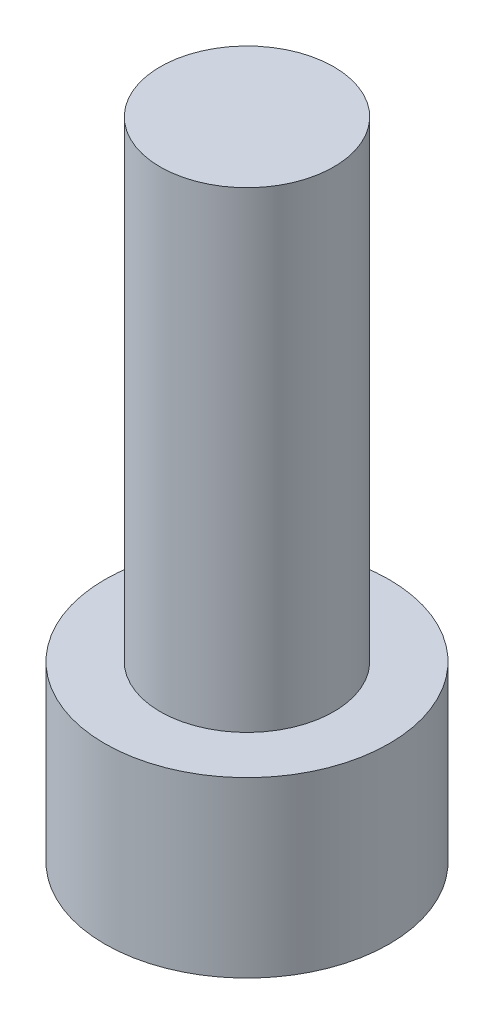
ISO-10303-21;
HEADER;
FILE_DESCRIPTION(('STEP AP214'),'2;1');
FILE_NAME('part.step','',(''),(''),'','','');
FILE_SCHEMA(('AUTOMOTIVE_DESIGN { 1 0 10303 214 1 1 1 1 }'));
ENDSEC;
DATA;
#1=APPLICATION_CONTEXT('core data for automotive mechanical design processes');
#2=APPLICATION_PROTOCOL_DEFINITION('international standard','automotive_design',2000,#1);
#3=PRODUCT_CONTEXT('',#1,'mechanical');
#4=PRODUCT('Part','Part','',(#3));
#5=PRODUCT_RELATED_PRODUCT_CATEGORY('part','',(#4));
#6=PRODUCT_DEFINITION_FORMATION('','',#4);
#7=PRODUCT_DEFINITION_CONTEXT('part definition',#1,'design');
#8=PRODUCT_DEFINITION('design','',#6,#7);
#9=PRODUCT_DEFINITION_SHAPE('','',#8);
#10=(LENGTH_UNIT() NAMED_UNIT(*) SI_UNIT(.MILLI.,.METRE.));
#11=(NAMED_UNIT(*) PLANE_ANGLE_UNIT() SI_UNIT($,.RADIAN.));
#12=(NAMED_UNIT(*) SI_UNIT($,.STERADIAN.) SOLID_ANGLE_UNIT());
#13=UNCERTAINTY_MEASURE_WITH_UNIT(LENGTH_MEASURE(1.E-05),#10,'distance_accuracy_value','');
#14=(GEOMETRIC_REPRESENTATION_CONTEXT(3) GLOBAL_UNCERTAINTY_ASSIGNED_CONTEXT((#13)) GLOBAL_UNIT_ASSIGNED_CONTEXT((#10,
#11,#12)) REPRESENTATION_CONTEXT('',''));
#15=CARTESIAN_POINT('',(0.,0.,0.));
#16=DIRECTION('',(0.,0.,1.));
#17=DIRECTION('',(1.,0.,0.));
#18=AXIS2_PLACEMENT_3D('',#15,#16,#17);
#19=CARTESIAN_POINT('',(0.,3.5052,0.));
#20=DIRECTION('',(0.,1.,0.));
#21=DIRECTION('',(0.,0.,1.));
#22=AXIS2_PLACEMENT_3D('',#19,#20,#21);
#23=PLANE('',#22);
#24=CARTESIAN_POINT('',(0.,3.5052,0.));
#25=DIRECTION('',(0.,1.,0.));
#26=DIRECTION('',(0.,0.,1.));
#27=AXIS2_PLACEMENT_3D('',#24,#25,#26);
#28=CIRCLE('',#27,2.8702);
#29=CARTESIAN_POINT('',(0.,3.5052,2.8702));
#30=VERTEX_POINT('',#29);
#31=EDGE_CURVE('E10',#30,#30,#28,.T.);
#32=ORIENTED_EDGE('',*,*,#31,.T.);
#33=EDGE_LOOP('',(#32));
#34=FACE_BOUND('',#33,.T.);
#35=CARTESIAN_POINT('',(0.,3.5052,0.));
#36=DIRECTION('',(0.,1.,0.));
#37=DIRECTION('',(0.,0.,1.));
#38=AXIS2_PLACEMENT_3D('',#35,#36,#37);
#39=CIRCLE('',#38,1.7526);
#40=CARTESIAN_POINT('',(0.,3.5052,-1.7526));
#41=VERTEX_POINT('',#40);
#42=EDGE_CURVE('E48',#41,#41,#39,.T.);
#43=ORIENTED_EDGE('',*,*,#42,.F.);
#44=EDGE_LOOP('',(#43));
#45=FACE_BOUND('',#44,.T.);
#46=ADVANCED_FACE('F35',(#34,#45),#23,.T.);
#47=CARTESIAN_POINT('',(0.,3.5052,0.));
#48=DIRECTION('',(0.,-1.,0.));
#49=DIRECTION('',(0.,0.,-1.));
#50=AXIS2_PLACEMENT_3D('',#47,#48,#49);
#51=CYLINDRICAL_SURFACE('',#50,2.8702);
#52=ORIENTED_EDGE('',*,*,#31,.F.);
#53=EDGE_LOOP('',(#52));
#54=FACE_BOUND('',#53,.T.);
#55=CARTESIAN_POINT('',(0.,0.,0.));
#56=DIRECTION('',(0.,1.,0.));
#57=DIRECTION('',(0.,0.,1.));
#58=AXIS2_PLACEMENT_3D('',#55,#56,#57);
#59=CIRCLE('',#58,2.8702);
#60=CARTESIAN_POINT('',(0.,0.,2.8702));
#61=VERTEX_POINT('',#60);
#62=EDGE_CURVE('E39',#61,#61,#59,.T.);
#63=ORIENTED_EDGE('',*,*,#62,.T.);
#64=EDGE_LOOP('',(#63));
#65=FACE_BOUND('',#64,.T.);
#66=ADVANCED_FACE('F37',(#54,#65),#51,.T.);
#67=CARTESIAN_POINT('',(0.,0.,0.));
#68=DIRECTION('',(0.,1.,0.));
#69=DIRECTION('',(0.,0.,1.));
#70=AXIS2_PLACEMENT_3D('',#67,#68,#69);
#71=PLANE('',#70);
#72=ORIENTED_EDGE('',*,*,#62,.F.);
#73=EDGE_LOOP('',(#72));
#74=FACE_BOUND('',#73,.T.);
#75=ADVANCED_FACE('F59',(#74),#71,.F.);
#76=CARTESIAN_POINT('',(0.,13.0302,0.));
#77=DIRECTION('',(0.,-1.,0.));
#78=DIRECTION('',(0.,0.,-1.));
#79=AXIS2_PLACEMENT_3D('',#76,#77,#78);
#80=CYLINDRICAL_SURFACE('',#79,1.7526);
#81=CARTESIAN_POINT('',(0.,13.0302,0.));
#82=DIRECTION('',(0.,1.,0.));
#83=DIRECTION('',(0.,0.,1.));
#84=AXIS2_PLACEMENT_3D('',#81,#82,#83);
#85=CIRCLE('',#84,1.7526);
#86=CARTESIAN_POINT('',(0.,13.0302,-1.7526));
#87=VERTEX_POINT('',#86);
#88=EDGE_CURVE('E46',#87,#87,#85,.T.);
#89=CARTESIAN_POINT('',(0.,13.0302,-1.7526));
#90=CARTESIAN_POINT('',(0.,12.93098125,-1.7526));
#91=CARTESIAN_POINT('',(0.,12.8317625,-1.7526));
#92=CARTESIAN_POINT('',(0.,12.633325,-1.7526));
#93=CARTESIAN_POINT('',(0.,12.53410625,-1.7526));
#94=CARTESIAN_POINT('',(0.,12.33566875,-1.7526));
#95=CARTESIAN_POINT('',(0.,12.23645,-1.7526));
#96=CARTESIAN_POINT('',(0.,12.0380125,-1.7526));
#97=CARTESIAN_POINT('',(0.,11.93879375,-1.7526));
#98=CARTESIAN_POINT('',(0.,11.74035625,-1.7526));
#99=CARTESIAN_POINT('',(0.,11.6411375,-1.7526));
#100=CARTESIAN_POINT('',(0.,11.4427,-1.7526));
#101=CARTESIAN_POINT('',(0.,11.34348125,-1.7526));
#102=CARTESIAN_POINT('',(0.,11.14504375,-1.7526));
#103=CARTESIAN_POINT('',(0.,11.045825,-1.7526));
#104=CARTESIAN_POINT('',(0.,10.8473875,-1.7526));
#105=CARTESIAN_POINT('',(0.,10.74816875,-1.7526));
#106=CARTESIAN_POINT('',(0.,10.54973125,-1.7526));
#107=CARTESIAN_POINT('',(0.,10.4505125,-1.7526));
#108=CARTESIAN_POINT('',(0.,10.252075,-1.7526));
#109=CARTESIAN_POINT('',(0.,10.15285625,-1.7526));
#110=CARTESIAN_POINT('',(0.,9.95441875,-1.7526));
#111=CARTESIAN_POINT('',(0.,9.8552,-1.7526));
#112=CARTESIAN_POINT('',(0.,9.6567625,-1.7526));
#113=CARTESIAN_POINT('',(0.,9.55754375,-1.7526));
#114=CARTESIAN_POINT('',(0.,9.35910625,-1.7526));
#115=CARTESIAN_POINT('',(0.,9.2598875,-1.7526));
#116=CARTESIAN_POINT('',(0.,9.06145,-1.7526));
#117=CARTESIAN_POINT('',(0.,8.96223125,-1.7526));
#118=CARTESIAN_POINT('',(0.,8.76379375,-1.7526));
#119=CARTESIAN_POINT('',(0.,8.664575,-1.7526));
#120=CARTESIAN_POINT('',(0.,8.4661375,-1.7526));
#121=CARTESIAN_POINT('',(0.,8.36691875,-1.7526));
#122=CARTESIAN_POINT('',(0.,8.16848125,-1.7526));
#123=CARTESIAN_POINT('',(0.,8.0692625,-1.7526));
#124=CARTESIAN_POINT('',(0.,7.870825,-1.7526));
#125=CARTESIAN_POINT('',(0.,7.77160625,-1.7526));
#126=CARTESIAN_POINT('',(0.,7.57316875,-1.7526));
#127=CARTESIAN_POINT('',(0.,7.47395,-1.7526));
#128=CARTESIAN_POINT('',(0.,7.2755125,-1.7526));
#129=CARTESIAN_POINT('',(0.,7.17629375,-1.7526));
#130=CARTESIAN_POINT('',(0.,6.97785625,-1.7526));
#131=CARTESIAN_POINT('',(0.,6.8786375,-1.7526));
#132=CARTESIAN_POINT('',(0.,6.6802,-1.7526));
#133=CARTESIAN_POINT('',(0.,6.58098125,-1.7526));
#134=CARTESIAN_POINT('',(0.,6.38254375,-1.7526));
#135=CARTESIAN_POINT('',(0.,6.283325,-1.7526));
#136=CARTESIAN_POINT('',(0.,6.0848875,-1.7526));
#137=CARTESIAN_POINT('',(0.,5.98566875,-1.7526));
#138=CARTESIAN_POINT('',(0.,5.78723125,-1.7526));
#139=CARTESIAN_POINT('',(0.,5.6880125,-1.7526));
#140=CARTESIAN_POINT('',(0.,5.489575,-1.7526));
#141=CARTESIAN_POINT('',(0.,5.39035625,-1.7526));
#142=CARTESIAN_POINT('',(0.,5.19191875,-1.7526));
#143=CARTESIAN_POINT('',(0.,5.0927,-1.7526));
#144=CARTESIAN_POINT('',(0.,4.8942625,-1.7526));
#145=CARTESIAN_POINT('',(0.,4.79504375,-1.7526));
#146=CARTESIAN_POINT('',(0.,4.59660625,-1.7526));
#147=CARTESIAN_POINT('',(0.,4.4973875,-1.7526));
#148=CARTESIAN_POINT('',(0.,4.29895,-1.7526));
#149=CARTESIAN_POINT('',(0.,4.19973125,-1.7526));
#150=CARTESIAN_POINT('',(0.,4.00129375,-1.7526));
#151=CARTESIAN_POINT('',(0.,3.902075,-1.7526));
#152=CARTESIAN_POINT('',(0.,3.7036375,-1.7526));
#153=CARTESIAN_POINT('',(0.,3.60441875,-1.7526));
#154=CARTESIAN_POINT('',(0.,3.5052,-1.7526));
#155=B_SPLINE_CURVE_WITH_KNOTS('',3,(#89,#90,#91,#92,#93,#94,#95,#96,#97,#98,#99,#100,#101,#102,
#103,#104,#105,#106,#107,#108,#109,#110,#111,#112,#113,#114,#115,#116,#117,#118,#119,#120,#121,
#122,#123,#124,#125,#126,#127,#128,#129,#130,#131,#132,#133,#134,#135,#136,#137,#138,#139,#140,
#141,#142,#143,#144,#145,#146,#147,#148,#149,#150,#151,#152,#153,#154),.UNSPECIFIED.,.F.,.F.,(4,
2,2,2,2,2,2,2,2,2,2,2,2,2,2,2,2,2,2,2,2,2,2,2,2,2,2,2,2,2,2,2,4),(0.,0.29765625,0.5953125,
0.892968750000001,1.190625,1.48828125,1.7859375,2.08359375,2.38125,2.67890625,2.9765625,
3.27421875,3.571875,3.86953125,4.1671875,4.46484375,4.7625,5.06015625,5.3578125,5.65546875,
5.953125,6.25078125,6.5484375,6.84609375,7.14375,7.44140625,7.7390625,8.03671875,8.334375,
8.63203125,8.9296875,9.22734375,9.525),.UNSPECIFIED.);
#156=EDGE_CURVE('BSEAM56',#87,#41,#155,.T.);
#157=ORIENTED_EDGE('',*,*,#88,.F.);
#158=ORIENTED_EDGE('',*,*,#42,.T.);
#159=ORIENTED_EDGE('',*,*,#156,.T.);
#160=ORIENTED_EDGE('',*,*,#156,.F.);
#161=EDGE_LOOP('',(#157,#159,#158,#160));
#162=FACE_BOUND('',#161,.T.);
#163=ADVANCED_FACE('F56',(#162),#80,.T.);
#164=CARTESIAN_POINT('',(0.,13.0302,0.));
#165=DIRECTION('',(0.,1.,0.));
#166=DIRECTION('',(0.,0.,1.));
#167=AXIS2_PLACEMENT_3D('',#164,#165,#166);
#168=PLANE('',#167);
#169=ORIENTED_EDGE('',*,*,#88,.T.);
#170=EDGE_LOOP('',(#169));
#171=FACE_BOUND('',#170,.T.);
#172=ADVANCED_FACE('F54',(#171),#168,.T.);
#173=CLOSED_SHELL('',(#46,#66,#75,#163,#172));
#174=MANIFOLD_SOLID_BREP('B2',#173);
#175=ADVANCED_BREP_SHAPE_REPRESENTATION('',(#18,#174),#14);
#176=SHAPE_DEFINITION_REPRESENTATION(#9,#175);
ENDSEC;
END-ISO-10303-21;
